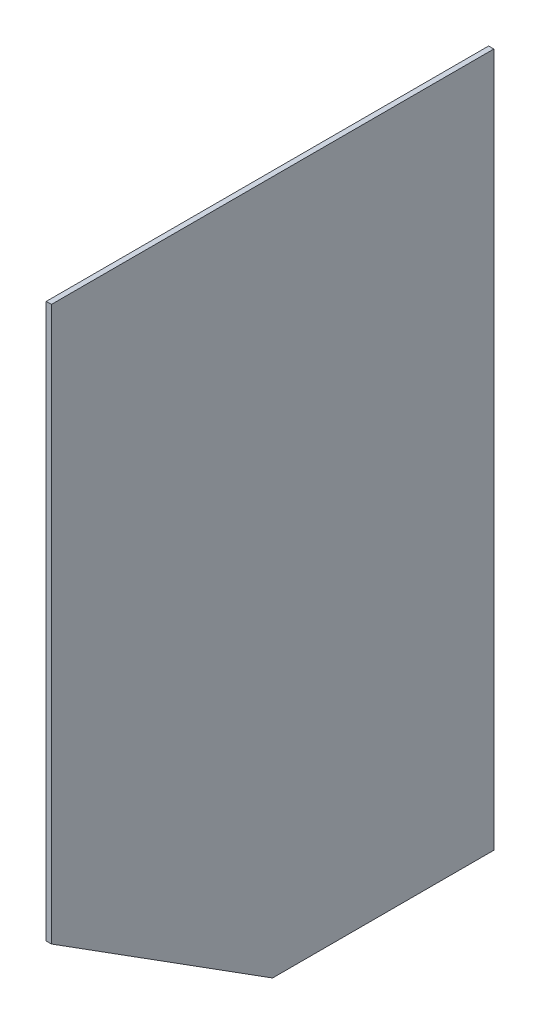
ISO-10303-21;
HEADER;
FILE_DESCRIPTION(('STEP AP214'),'2;1');
FILE_NAME('part.step','',(''),(''),'','','');
FILE_SCHEMA(('AUTOMOTIVE_DESIGN { 1 0 10303 214 1 1 1 1 }'));
ENDSEC;
DATA;
#1=APPLICATION_CONTEXT('core data for automotive mechanical design processes');
#2=APPLICATION_PROTOCOL_DEFINITION('international standard','automotive_design',2000,#1);
#3=PRODUCT_CONTEXT('',#1,'mechanical');
#4=PRODUCT('Part','Part','',(#3));
#5=PRODUCT_RELATED_PRODUCT_CATEGORY('part','',(#4));
#6=PRODUCT_DEFINITION_FORMATION('','',#4);
#7=PRODUCT_DEFINITION_CONTEXT('part definition',#1,'design');
#8=PRODUCT_DEFINITION('design','',#6,#7);
#9=PRODUCT_DEFINITION_SHAPE('','',#8);
#10=(LENGTH_UNIT() NAMED_UNIT(*) SI_UNIT(.MILLI.,.METRE.));
#11=(NAMED_UNIT(*) PLANE_ANGLE_UNIT() SI_UNIT($,.RADIAN.));
#12=(NAMED_UNIT(*) SI_UNIT($,.STERADIAN.) SOLID_ANGLE_UNIT());
#13=UNCERTAINTY_MEASURE_WITH_UNIT(LENGTH_MEASURE(1.E-05),#10,'distance_accuracy_value','');
#14=(GEOMETRIC_REPRESENTATION_CONTEXT(3) GLOBAL_UNCERTAINTY_ASSIGNED_CONTEXT((#13)) GLOBAL_UNIT_ASSIGNED_CONTEXT((#10,
#11,#12)) REPRESENTATION_CONTEXT('',''));
#15=CARTESIAN_POINT('',(0.,0.,0.));
#16=DIRECTION('',(0.,0.,1.));
#17=DIRECTION('',(1.,0.,0.));
#18=AXIS2_PLACEMENT_3D('',#15,#16,#17);
#19=CARTESIAN_POINT('',(0.,269.292724576628,-255.));
#20=DIRECTION('',(0.,-1.,0.));
#21=DIRECTION('',(0.,0.,-1.));
#22=AXIS2_PLACEMENT_3D('',#19,#20,#21);
#23=PLANE('',#22);
#24=DIRECTION('',(1.,0.,0.));
#25=VECTOR('',#24,1.);
#26=CARTESIAN_POINT('',(0.,269.292724576628,0.));
#27=LINE('',#26,#25);
#28=CARTESIAN_POINT('',(-140.699495780971,269.292724576628,0.));
#29=VERTEX_POINT('',#28);
#30=CARTESIAN_POINT('',(-137.699495780971,269.292724576628,0.));
#31=VERTEX_POINT('',#30);
#32=EDGE_CURVE('E97',#29,#31,#27,.T.);
#33=ORIENTED_EDGE('',*,*,#32,.T.);
#34=DIRECTION('',(0.,0.,1.));
#35=VECTOR('',#34,1.);
#36=CARTESIAN_POINT('',(-137.699495780971,269.292724576628,-255.));
#37=LINE('',#36,#35);
#38=CARTESIAN_POINT('',(-137.699495780971,269.292724576628,-255.));
#39=VERTEX_POINT('',#38);
#40=EDGE_CURVE('E11',#39,#31,#37,.T.);
#41=ORIENTED_EDGE('',*,*,#40,.F.);
#42=DIRECTION('',(1.,0.,0.));
#43=VECTOR('',#42,1.);
#44=CARTESIAN_POINT('',(0.,269.292724576628,-255.));
#45=LINE('',#44,#43);
#46=CARTESIAN_POINT('',(-140.699495780971,269.292724576628,-255.));
#47=VERTEX_POINT('',#46);
#48=EDGE_CURVE('E109',#47,#39,#45,.T.);
#49=ORIENTED_EDGE('',*,*,#48,.F.);
#50=DIRECTION('',(0.,0.,1.));
#51=VECTOR('',#50,1.);
#52=CARTESIAN_POINT('',(-140.699495780971,269.292724576628,-255.));
#53=LINE('',#52,#51);
#54=EDGE_CURVE('E38',#47,#29,#53,.T.);
#55=ORIENTED_EDGE('',*,*,#54,.T.);
#56=EDGE_LOOP('',(#33,#41,#49,#55));
#57=FACE_BOUND('',#56,.T.);
#58=ADVANCED_FACE('F35',(#57),#23,.F.);
#59=CARTESIAN_POINT('',(-137.699495780971,0.,-255.));
#60=DIRECTION('',(-1.,0.,0.));
#61=DIRECTION('',(0.,0.,1.));
#62=AXIS2_PLACEMENT_3D('',#59,#60,#61);
#63=PLANE('',#62);
#64=DIRECTION('',(0.,-1.,0.));
#65=VECTOR('',#64,1.);
#66=CARTESIAN_POINT('',(-137.699495780971,0.,0.));
#67=LINE('',#66,#65);
#68=CARTESIAN_POINT('',(-137.699495780971,-50.,0.));
#69=VERTEX_POINT('',#68);
#70=EDGE_CURVE('E74',#31,#69,#67,.T.);
#71=ORIENTED_EDGE('',*,*,#70,.T.);
#72=DIRECTION('',(0.,-0.534849985337946,-0.844947035727091));
#73=VECTOR('',#72,1.);
#74=CARTESIAN_POINT('',(-137.699495780971,-35.6967746591999,22.5959954834988));
#75=LINE('',#74,#73);
#76=CARTESIAN_POINT('',(-137.699495780971,-130.707275423372,-127.5));
#77=VERTEX_POINT('',#76);
#78=EDGE_CURVE('E51',#69,#77,#75,.T.);
#79=ORIENTED_EDGE('',*,*,#78,.T.);
#80=DIRECTION('',(0.,0.,1.));
#81=VECTOR('',#80,1.);
#82=CARTESIAN_POINT('',(-137.699495780971,-130.707275423372,-255.));
#83=LINE('',#82,#81);
#84=CARTESIAN_POINT('',(-137.699495780971,-130.707275423372,-255.));
#85=VERTEX_POINT('',#84);
#86=EDGE_CURVE('E43',#85,#77,#83,.T.);
#87=ORIENTED_EDGE('',*,*,#86,.F.);
#88=DIRECTION('',(0.,-1.,0.));
#89=VECTOR('',#88,1.);
#90=CARTESIAN_POINT('',(-137.699495780971,0.,-255.));
#91=LINE('',#90,#89);
#92=EDGE_CURVE('E59',#39,#85,#91,.T.);
#93=ORIENTED_EDGE('',*,*,#92,.F.);
#94=ORIENTED_EDGE('',*,*,#40,.T.);
#95=EDGE_LOOP('',(#71,#79,#87,#93,#94));
#96=FACE_BOUND('',#95,.T.);
#97=ADVANCED_FACE('F100',(#96),#63,.F.);
#98=CARTESIAN_POINT('',(0.,-130.707275423372,-255.));
#99=DIRECTION('',(0.,1.,0.));
#100=DIRECTION('',(0.,0.,1.));
#101=AXIS2_PLACEMENT_3D('',#98,#99,#100);
#102=PLANE('',#101);
#103=ORIENTED_EDGE('',*,*,#86,.T.);
#104=DIRECTION('',(-1.,0.,0.));
#105=VECTOR('',#104,1.);
#106=CARTESIAN_POINT('',(-137.699495780971,-130.707275423372,-127.5));
#107=LINE('',#106,#105);
#108=CARTESIAN_POINT('',(-140.699495780971,-130.707275423372,-127.5));
#109=VERTEX_POINT('',#108);
#110=EDGE_CURVE('E89',#77,#109,#107,.T.);
#111=ORIENTED_EDGE('',*,*,#110,.T.);
#112=DIRECTION('',(0.,0.,1.));
#113=VECTOR('',#112,1.);
#114=CARTESIAN_POINT('',(-140.699495780971,-130.707275423372,-255.));
#115=LINE('',#114,#113);
#116=CARTESIAN_POINT('',(-140.699495780971,-130.707275423372,-255.));
#117=VERTEX_POINT('',#116);
#118=EDGE_CURVE('E105',#117,#109,#115,.T.);
#119=ORIENTED_EDGE('',*,*,#118,.F.);
#120=DIRECTION('',(-1.,0.,0.));
#121=VECTOR('',#120,1.);
#122=CARTESIAN_POINT('',(0.,-130.707275423372,-255.));
#123=LINE('',#122,#121);
#124=EDGE_CURVE('E104',#85,#117,#123,.T.);
#125=ORIENTED_EDGE('',*,*,#124,.F.);
#126=EDGE_LOOP('',(#103,#111,#119,#125));
#127=FACE_BOUND('',#126,.T.);
#128=ADVANCED_FACE('F103',(#127),#102,.F.);
#129=CARTESIAN_POINT('',(-140.699495780971,0.,-255.));
#130=DIRECTION('',(1.,0.,0.));
#131=DIRECTION('',(0.,0.,-1.));
#132=AXIS2_PLACEMENT_3D('',#129,#130,#131);
#133=PLANE('',#132);
#134=ORIENTED_EDGE('',*,*,#118,.T.);
#135=DIRECTION('',(0.,-0.534849985337946,-0.844947035727091));
#136=VECTOR('',#135,1.);
#137=CARTESIAN_POINT('',(-140.699495780971,-35.6967746591999,22.5959954834988));
#138=LINE('',#137,#136);
#139=CARTESIAN_POINT('',(-140.699495780971,-50.,0.));
#140=VERTEX_POINT('',#139);
#141=EDGE_CURVE('E92',#140,#109,#138,.T.);
#142=ORIENTED_EDGE('',*,*,#141,.F.);
#143=DIRECTION('',(0.,1.,0.));
#144=VECTOR('',#143,1.);
#145=CARTESIAN_POINT('',(-140.699495780971,0.,0.));
#146=LINE('',#145,#144);
#147=EDGE_CURVE('E110',#140,#29,#146,.T.);
#148=ORIENTED_EDGE('',*,*,#147,.T.);
#149=ORIENTED_EDGE('',*,*,#54,.F.);
#150=DIRECTION('',(0.,1.,0.));
#151=VECTOR('',#150,1.);
#152=CARTESIAN_POINT('',(-140.699495780971,0.,-255.));
#153=LINE('',#152,#151);
#154=EDGE_CURVE('E80',#117,#47,#153,.T.);
#155=ORIENTED_EDGE('',*,*,#154,.F.);
#156=EDGE_LOOP('',(#134,#142,#148,#149,#155));
#157=FACE_BOUND('',#156,.T.);
#158=ADVANCED_FACE('F121',(#157),#133,.F.);
#159=CARTESIAN_POINT('',(0.,0.,-255.));
#160=DIRECTION('',(0.,0.,1.));
#161=DIRECTION('',(1.,0.,0.));
#162=AXIS2_PLACEMENT_3D('',#159,#160,#161);
#163=PLANE('',#162);
#164=ORIENTED_EDGE('',*,*,#48,.T.);
#165=ORIENTED_EDGE('',*,*,#92,.T.);
#166=ORIENTED_EDGE('',*,*,#124,.T.);
#167=ORIENTED_EDGE('',*,*,#154,.T.);
#168=EDGE_LOOP('',(#164,#165,#166,#167));
#169=FACE_BOUND('',#168,.T.);
#170=ADVANCED_FACE('F127',(#169),#163,.F.);
#171=CARTESIAN_POINT('',(0.,0.,0.));
#172=DIRECTION('',(0.,0.,1.));
#173=DIRECTION('',(1.,0.,0.));
#174=AXIS2_PLACEMENT_3D('',#171,#172,#173);
#175=PLANE('',#174);
#176=DIRECTION('',(-1.,0.,0.));
#177=VECTOR('',#176,1.);
#178=CARTESIAN_POINT('',(-137.699495780971,-50.,0.));
#179=LINE('',#178,#177);
#180=EDGE_CURVE('E98',#69,#140,#179,.T.);
#181=ORIENTED_EDGE('',*,*,#180,.F.);
#182=ORIENTED_EDGE('',*,*,#70,.F.);
#183=ORIENTED_EDGE('',*,*,#32,.F.);
#184=ORIENTED_EDGE('',*,*,#147,.F.);
#185=EDGE_LOOP('',(#181,#182,#183,#184));
#186=FACE_BOUND('',#185,.T.);
#187=ADVANCED_FACE('F123',(#186),#175,.T.);
#188=CARTESIAN_POINT('',(-137.699495780971,-35.6967746591999,22.5959954834988));
#189=DIRECTION('',(0.,0.844947035727091,-0.534849985337946));
#190=DIRECTION('',(0.,0.534849985337946,0.844947035727091));
#191=AXIS2_PLACEMENT_3D('',#188,#189,#190);
#192=PLANE('',#191);
#193=ORIENTED_EDGE('',*,*,#141,.T.);
#194=ORIENTED_EDGE('',*,*,#110,.F.);
#195=ORIENTED_EDGE('',*,*,#78,.F.);
#196=ORIENTED_EDGE('',*,*,#180,.T.);
#197=EDGE_LOOP('',(#193,#194,#195,#196));
#198=FACE_BOUND('',#197,.T.);
#199=ADVANCED_FACE('F90',(#198),#192,.F.);
#200=CLOSED_SHELL('',(#58,#97,#128,#158,#170,#187,#199));
#201=MANIFOLD_SOLID_BREP('B2',#200);
#202=ADVANCED_BREP_SHAPE_REPRESENTATION('',(#18,#201),#14);
#203=SHAPE_DEFINITION_REPRESENTATION(#9,#202);
ENDSEC;
END-ISO-10303-21;
